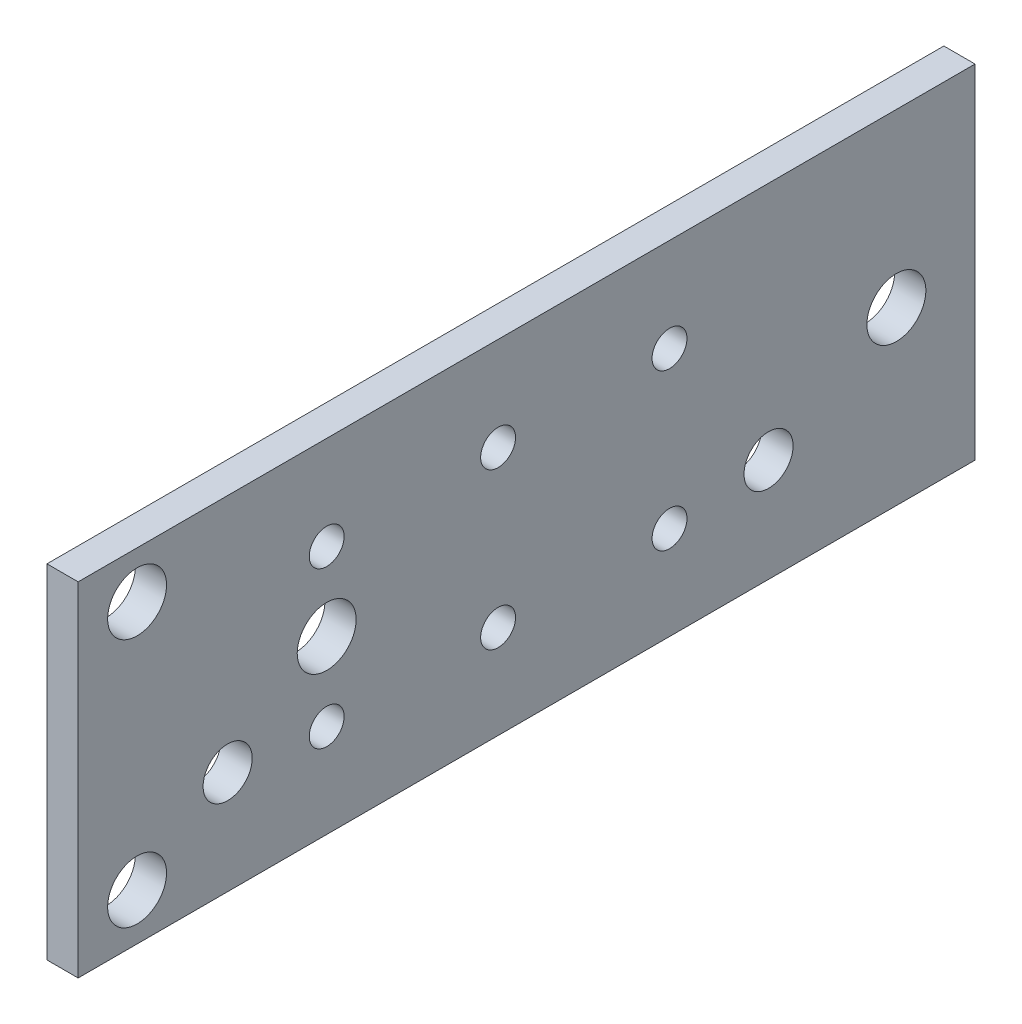
ISO-10303-21;
HEADER;
FILE_DESCRIPTION(('STEP AP214'),'2;1');
FILE_NAME('part.step','',(''),(''),'','','');
FILE_SCHEMA(('AUTOMOTIVE_DESIGN { 1 0 10303 214 1 1 1 1 }'));
ENDSEC;
DATA;
#1=APPLICATION_CONTEXT('core data for automotive mechanical design processes');
#2=APPLICATION_PROTOCOL_DEFINITION('international standard','automotive_design',2000,#1);
#3=PRODUCT_CONTEXT('',#1,'mechanical');
#4=PRODUCT('Part','Part','',(#3));
#5=PRODUCT_RELATED_PRODUCT_CATEGORY('part','',(#4));
#6=PRODUCT_DEFINITION_FORMATION('','',#4);
#7=PRODUCT_DEFINITION_CONTEXT('part definition',#1,'design');
#8=PRODUCT_DEFINITION('design','',#6,#7);
#9=PRODUCT_DEFINITION_SHAPE('','',#8);
#10=(LENGTH_UNIT() NAMED_UNIT(*) SI_UNIT(.MILLI.,.METRE.));
#11=(NAMED_UNIT(*) PLANE_ANGLE_UNIT() SI_UNIT($,.RADIAN.));
#12=(NAMED_UNIT(*) SI_UNIT($,.STERADIAN.) SOLID_ANGLE_UNIT());
#13=UNCERTAINTY_MEASURE_WITH_UNIT(LENGTH_MEASURE(1.E-05),#10,'distance_accuracy_value','');
#14=(GEOMETRIC_REPRESENTATION_CONTEXT(3) GLOBAL_UNCERTAINTY_ASSIGNED_CONTEXT((#13)) GLOBAL_UNIT_ASSIGNED_CONTEXT((#10,
#11,#12)) REPRESENTATION_CONTEXT('',''));
#15=CARTESIAN_POINT('',(0.,0.,0.));
#16=DIRECTION('',(0.,0.,1.));
#17=DIRECTION('',(1.,0.,0.));
#18=AXIS2_PLACEMENT_3D('',#15,#16,#17);
#19=CARTESIAN_POINT('',(0.,-34.925,0.));
#20=DIRECTION('',(0.,-1.,0.));
#21=DIRECTION('',(0.,0.,-1.));
#22=AXIS2_PLACEMENT_3D('',#19,#20,#21);
#23=PLANE('',#22);
#24=DIRECTION('',(0.,0.,-1.));
#25=VECTOR('',#24,1.);
#26=CARTESIAN_POINT('',(-3.175,-34.925,5.));
#27=LINE('',#26,#25);
#28=CARTESIAN_POINT('',(-3.175,-34.925,0.));
#29=VERTEX_POINT('',#28);
#30=CARTESIAN_POINT('',(-3.175,-34.925,-91.3));
#31=VERTEX_POINT('',#30);
#32=EDGE_CURVE('E162',#29,#31,#27,.T.);
#33=ORIENTED_EDGE('',*,*,#32,.T.);
#34=DIRECTION('',(1.,0.,0.));
#35=VECTOR('',#34,1.);
#36=CARTESIAN_POINT('',(-3.175,-34.925,-91.3));
#37=LINE('',#36,#35);
#38=CARTESIAN_POINT('',(0.,-34.925,-91.3));
#39=VERTEX_POINT('',#38);
#40=EDGE_CURVE('E247',#31,#39,#37,.T.);
#41=ORIENTED_EDGE('',*,*,#40,.T.);
#42=DIRECTION('',(0.,0.,1.));
#43=VECTOR('',#42,1.);
#44=CARTESIAN_POINT('',(0.,-34.925,5.));
#45=LINE('',#44,#43);
#46=CARTESIAN_POINT('',(0.,-34.925,0.));
#47=VERTEX_POINT('',#46);
#48=EDGE_CURVE('E110',#47,#39,#45,.F.);
#49=ORIENTED_EDGE('',*,*,#48,.F.);
#50=DIRECTION('',(1.,0.,0.));
#51=VECTOR('',#50,1.);
#52=CARTESIAN_POINT('',(-3.175,-34.925,0.));
#53=LINE('',#52,#51);
#54=EDGE_CURVE('E133',#29,#47,#53,.T.);
#55=ORIENTED_EDGE('',*,*,#54,.F.);
#56=EDGE_LOOP('',(#33,#41,#49,#55));
#57=FACE_BOUND('',#56,.T.);
#58=ADVANCED_FACE('F101',(#57),#23,.T.);
#59=CARTESIAN_POINT('',(-3.175,0.,-115.));
#60=DIRECTION('',(0.,-1.,0.));
#61=DIRECTION('',(0.,0.,-1.));
#62=AXIS2_PLACEMENT_3D('',#59,#60,#61);
#63=PLANE('',#62);
#64=DIRECTION('',(1.,0.,0.));
#65=VECTOR('',#64,1.);
#66=CARTESIAN_POINT('',(-3.175,0.,-91.3));
#67=LINE('',#66,#65);
#68=CARTESIAN_POINT('',(-3.175,0.,-91.3));
#69=VERTEX_POINT('',#68);
#70=CARTESIAN_POINT('',(0.,0.,-91.3));
#71=VERTEX_POINT('',#70);
#72=EDGE_CURVE('E125',#69,#71,#67,.T.);
#73=ORIENTED_EDGE('',*,*,#72,.F.);
#74=DIRECTION('',(0.,0.,1.));
#75=VECTOR('',#74,1.);
#76=CARTESIAN_POINT('',(-3.175,0.,-115.));
#77=LINE('',#76,#75);
#78=CARTESIAN_POINT('',(-3.175,0.,0.));
#79=VERTEX_POINT('',#78);
#80=EDGE_CURVE('E13',#69,#79,#77,.T.);
#81=ORIENTED_EDGE('',*,*,#80,.T.);
#82=DIRECTION('',(1.,0.,0.));
#83=VECTOR('',#82,1.);
#84=CARTESIAN_POINT('',(-3.175,0.,0.));
#85=LINE('',#84,#83);
#86=CARTESIAN_POINT('',(0.,0.,0.));
#87=VERTEX_POINT('',#86);
#88=EDGE_CURVE('E148',#79,#87,#85,.T.);
#89=ORIENTED_EDGE('',*,*,#88,.T.);
#90=DIRECTION('',(0.,0.,-1.));
#91=VECTOR('',#90,1.);
#92=CARTESIAN_POINT('',(0.,0.,-115.));
#93=LINE('',#92,#91);
#94=EDGE_CURVE('E113',#87,#71,#93,.T.);
#95=ORIENTED_EDGE('',*,*,#94,.T.);
#96=EDGE_LOOP('',(#73,#81,#89,#95));
#97=FACE_BOUND('',#96,.T.);
#98=ADVANCED_FACE('F102',(#97),#63,.F.);
#99=CARTESIAN_POINT('',(-3.175,3.17499999999999,5.));
#100=DIRECTION('',(-1.,0.,0.));
#101=DIRECTION('',(0.,0.,1.));
#102=AXIS2_PLACEMENT_3D('',#99,#100,#101);
#103=PLANE('',#102);
#104=DIRECTION('',(0.,1.,0.));
#105=VECTOR('',#104,1.);
#106=CARTESIAN_POINT('',(-3.175,0.,-91.3));
#107=LINE('',#106,#105);
#108=EDGE_CURVE('E145',#31,#69,#107,.T.);
#109=ORIENTED_EDGE('',*,*,#108,.F.);
#110=ORIENTED_EDGE('',*,*,#32,.F.);
#111=DIRECTION('',(0.,1.,0.));
#112=VECTOR('',#111,1.);
#113=CARTESIAN_POINT('',(-3.175,-34.925,0.));
#114=LINE('',#113,#112);
#115=EDGE_CURVE('E151',#29,#79,#114,.T.);
#116=ORIENTED_EDGE('',*,*,#115,.T.);
#117=ORIENTED_EDGE('',*,*,#80,.F.);
#118=EDGE_LOOP('',(#109,#110,#116,#117));
#119=FACE_BOUND('',#118,.T.);
#120=CARTESIAN_POINT('',(-3.175,-24.3999999999816,-70.2800000000124));
#121=DIRECTION('',(1.,0.,0.));
#122=DIRECTION('',(0.,0.,-1.));
#123=AXIS2_PLACEMENT_3D('',#120,#121,#122);
#124=CIRCLE('',#123,2.49999999999991);
#125=CARTESIAN_POINT('',(-3.175,-24.3999999999816,-72.7800000000124));
#126=VERTEX_POINT('',#125);
#127=EDGE_CURVE('E169',#126,#126,#124,.T.);
#128=ORIENTED_EDGE('',*,*,#127,.T.);
#129=EDGE_LOOP('',(#128));
#130=FACE_BOUND('',#129,.T.);
#131=CARTESIAN_POINT('',(-3.175,-25.3999999999814,-60.2000000000126));
#132=DIRECTION('',(1.,0.,0.));
#133=DIRECTION('',(0.,0.,-1.));
#134=AXIS2_PLACEMENT_3D('',#131,#132,#133);
#135=CIRCLE('',#134,1.77800000000008);
#136=CARTESIAN_POINT('',(-3.175,-25.3999999999814,-61.9780000000127));
#137=VERTEX_POINT('',#136);
#138=EDGE_CURVE('E177',#137,#137,#135,.T.);
#139=ORIENTED_EDGE('',*,*,#138,.T.);
#140=EDGE_LOOP('',(#139));
#141=FACE_BOUND('',#140,.T.);
#142=CARTESIAN_POINT('',(-3.175,-25.3999999999816,-42.7500000000124));
#143=DIRECTION('',(1.,0.,0.));
#144=DIRECTION('',(0.,0.,-1.));
#145=AXIS2_PLACEMENT_3D('',#142,#143,#144);
#146=CIRCLE('',#145,1.77799999999986);
#147=CARTESIAN_POINT('',(-3.175,-25.3999999999816,-44.5280000000123));
#148=VERTEX_POINT('',#147);
#149=EDGE_CURVE('E184',#148,#148,#146,.T.);
#150=ORIENTED_EDGE('',*,*,#149,.T.);
#151=EDGE_LOOP('',(#150));
#152=FACE_BOUND('',#151,.T.);
#153=CARTESIAN_POINT('',(-3.175,-25.3999999999817,-25.3000000000124));
#154=DIRECTION('',(1.,0.,0.));
#155=DIRECTION('',(0.,0.,-1.));
#156=AXIS2_PLACEMENT_3D('',#153,#154,#155);
#157=CIRCLE('',#156,1.77799999999986);
#158=CARTESIAN_POINT('',(-3.175,-25.3999999999817,-27.0780000000123));
#159=VERTEX_POINT('',#158);
#160=EDGE_CURVE('E191',#159,#159,#157,.T.);
#161=ORIENTED_EDGE('',*,*,#160,.T.);
#162=EDGE_LOOP('',(#161));
#163=FACE_BOUND('',#162,.T.);
#164=CARTESIAN_POINT('',(-3.175,-24.399999999982,-15.2200000000126));
#165=DIRECTION('',(1.,0.,0.));
#166=DIRECTION('',(0.,0.,-1.));
#167=AXIS2_PLACEMENT_3D('',#164,#165,#166);
#168=CIRCLE('',#167,2.49999999999991);
#169=CARTESIAN_POINT('',(-3.175,-24.399999999982,-17.7200000000125));
#170=VERTEX_POINT('',#169);
#171=EDGE_CURVE('E200',#170,#170,#168,.T.);
#172=ORIENTED_EDGE('',*,*,#171,.T.);
#173=EDGE_LOOP('',(#172));
#174=FACE_BOUND('',#173,.T.);
#175=CARTESIAN_POINT('',(-3.175,-9.52499999998159,-25.3000000000123));
#176=DIRECTION('',(1.,0.,0.));
#177=DIRECTION('',(0.,0.,-1.));
#178=AXIS2_PLACEMENT_3D('',#175,#176,#177);
#179=CIRCLE('',#178,1.77799999999986);
#180=CARTESIAN_POINT('',(-3.175,-9.52499999998159,-27.0780000000122));
#181=VERTEX_POINT('',#180);
#182=EDGE_CURVE('E205',#181,#181,#179,.T.);
#183=ORIENTED_EDGE('',*,*,#182,.T.);
#184=EDGE_LOOP('',(#183));
#185=FACE_BOUND('',#184,.T.);
#186=CARTESIAN_POINT('',(-3.175,-9.52499999998147,-42.7500000000123));
#187=DIRECTION('',(1.,0.,0.));
#188=DIRECTION('',(0.,0.,-1.));
#189=AXIS2_PLACEMENT_3D('',#186,#187,#188);
#190=CIRCLE('',#189,1.77799999999986);
#191=CARTESIAN_POINT('',(-3.175,-9.52499999998147,-44.5280000000121));
#192=VERTEX_POINT('',#191);
#193=EDGE_CURVE('E209',#192,#192,#190,.T.);
#194=ORIENTED_EDGE('',*,*,#193,.T.);
#195=EDGE_LOOP('',(#194));
#196=FACE_BOUND('',#195,.T.);
#197=CARTESIAN_POINT('',(-3.175,-9.52499999998135,-60.2000000000125));
#198=DIRECTION('',(1.,0.,0.));
#199=DIRECTION('',(0.,0.,-1.));
#200=AXIS2_PLACEMENT_3D('',#197,#198,#199);
#201=CIRCLE('',#200,1.77800000000008);
#202=CARTESIAN_POINT('',(-3.175,-9.52499999998135,-61.9780000000125));
#203=VERTEX_POINT('',#202);
#204=EDGE_CURVE('E156',#203,#203,#201,.T.);
#205=ORIENTED_EDGE('',*,*,#204,.T.);
#206=EDGE_LOOP('',(#205));
#207=FACE_BOUND('',#206,.T.);
#208=CARTESIAN_POINT('',(-3.175,-17.4625,-83.29));
#209=DIRECTION('',(-1.,0.,0.));
#210=DIRECTION('',(0.,0.,1.));
#211=AXIS2_PLACEMENT_3D('',#208,#209,#210);
#212=CIRCLE('',#211,3.00000000000002);
#213=CARTESIAN_POINT('',(-3.175,-17.4625,-80.29));
#214=VERTEX_POINT('',#213);
#215=EDGE_CURVE('E229',#214,#214,#212,.T.);
#216=ORIENTED_EDGE('',*,*,#215,.F.);
#217=EDGE_LOOP('',(#216));
#218=FACE_BOUND('',#217,.T.);
#219=CARTESIAN_POINT('',(-3.175,-4.7625,-6.));
#220=DIRECTION('',(-1.,0.,0.));
#221=DIRECTION('',(0.,0.,1.));
#222=AXIS2_PLACEMENT_3D('',#219,#220,#221);
#223=CIRCLE('',#222,3.);
#224=CARTESIAN_POINT('',(-3.175,-4.7625,-3.));
#225=VERTEX_POINT('',#224);
#226=EDGE_CURVE('E222',#225,#225,#223,.T.);
#227=ORIENTED_EDGE('',*,*,#226,.F.);
#228=EDGE_LOOP('',(#227));
#229=FACE_BOUND('',#228,.T.);
#230=CARTESIAN_POINT('',(-3.175,-30.1625,-6.));
#231=DIRECTION('',(-1.,0.,0.));
#232=DIRECTION('',(0.,0.,1.));
#233=AXIS2_PLACEMENT_3D('',#230,#231,#232);
#234=CIRCLE('',#233,3.);
#235=CARTESIAN_POINT('',(-3.175,-30.1625,-3.));
#236=VERTEX_POINT('',#235);
#237=EDGE_CURVE('E220',#236,#236,#234,.T.);
#238=ORIENTED_EDGE('',*,*,#237,.F.);
#239=EDGE_LOOP('',(#238));
#240=FACE_BOUND('',#239,.T.);
#241=CARTESIAN_POINT('',(-3.175,-17.4625,-25.3));
#242=DIRECTION('',(-1.,0.,0.));
#243=DIRECTION('',(0.,0.,1.));
#244=AXIS2_PLACEMENT_3D('',#241,#242,#243);
#245=CIRCLE('',#244,3.00000000000001);
#246=CARTESIAN_POINT('',(-3.175,-17.4625,-22.3));
#247=VERTEX_POINT('',#246);
#248=EDGE_CURVE('E218',#247,#247,#245,.T.);
#249=ORIENTED_EDGE('',*,*,#248,.F.);
#250=EDGE_LOOP('',(#249));
#251=FACE_BOUND('',#250,.T.);
#252=ADVANCED_FACE('F157',(#119,#130,#141,#152,#163,#174,#185,#196,#207,#218,#229,#240,#251),
#103,.T.);
#253=CARTESIAN_POINT('',(0.,-34.925,5.));
#254=DIRECTION('',(-1.,0.,0.));
#255=DIRECTION('',(0.,0.,1.));
#256=AXIS2_PLACEMENT_3D('',#253,#254,#255);
#257=PLANE('',#256);
#258=CARTESIAN_POINT('',(0.,-17.4625,-25.3));
#259=DIRECTION('',(-1.,0.,0.));
#260=DIRECTION('',(0.,0.,1.));
#261=AXIS2_PLACEMENT_3D('',#258,#259,#260);
#262=CIRCLE('',#261,3.00000000000001);
#263=CARTESIAN_POINT('',(0.,-17.4625,-22.3));
#264=VERTEX_POINT('',#263);
#265=EDGE_CURVE('E232',#264,#264,#262,.T.);
#266=ORIENTED_EDGE('',*,*,#265,.T.);
#267=EDGE_LOOP('',(#266));
#268=FACE_BOUND('',#267,.T.);
#269=CARTESIAN_POINT('',(0.,-30.1625,-6.));
#270=DIRECTION('',(-1.,0.,0.));
#271=DIRECTION('',(0.,0.,1.));
#272=AXIS2_PLACEMENT_3D('',#269,#270,#271);
#273=CIRCLE('',#272,3.);
#274=CARTESIAN_POINT('',(0.,-30.1625,-3.));
#275=VERTEX_POINT('',#274);
#276=EDGE_CURVE('E221',#275,#275,#273,.T.);
#277=ORIENTED_EDGE('',*,*,#276,.T.);
#278=EDGE_LOOP('',(#277));
#279=FACE_BOUND('',#278,.T.);
#280=CARTESIAN_POINT('',(0.,-4.7625,-6.));
#281=DIRECTION('',(-1.,0.,0.));
#282=DIRECTION('',(0.,0.,1.));
#283=AXIS2_PLACEMENT_3D('',#280,#281,#282);
#284=CIRCLE('',#283,3.);
#285=CARTESIAN_POINT('',(0.,-4.7625,-3.));
#286=VERTEX_POINT('',#285);
#287=EDGE_CURVE('E227',#286,#286,#284,.T.);
#288=ORIENTED_EDGE('',*,*,#287,.T.);
#289=EDGE_LOOP('',(#288));
#290=FACE_BOUND('',#289,.T.);
#291=CARTESIAN_POINT('',(0.,-17.4625,-83.29));
#292=DIRECTION('',(-1.,0.,0.));
#293=DIRECTION('',(0.,0.,1.));
#294=AXIS2_PLACEMENT_3D('',#291,#292,#293);
#295=CIRCLE('',#294,3.00000000000002);
#296=CARTESIAN_POINT('',(0.,-17.4625,-80.29));
#297=VERTEX_POINT('',#296);
#298=EDGE_CURVE('E175',#297,#297,#295,.T.);
#299=ORIENTED_EDGE('',*,*,#298,.T.);
#300=EDGE_LOOP('',(#299));
#301=FACE_BOUND('',#300,.T.);
#302=CARTESIAN_POINT('',(0.,-9.52499999998135,-60.2000000000125));
#303=DIRECTION('',(1.,0.,0.));
#304=DIRECTION('',(0.,0.,-1.));
#305=AXIS2_PLACEMENT_3D('',#302,#303,#304);
#306=CIRCLE('',#305,1.77800000000008);
#307=CARTESIAN_POINT('',(0.,-9.52499999998135,-61.9780000000125));
#308=VERTEX_POINT('',#307);
#309=EDGE_CURVE('E212',#308,#308,#306,.T.);
#310=ORIENTED_EDGE('',*,*,#309,.F.);
#311=EDGE_LOOP('',(#310));
#312=FACE_BOUND('',#311,.T.);
#313=CARTESIAN_POINT('',(0.,-9.52499999998147,-42.7500000000123));
#314=DIRECTION('',(1.,0.,0.));
#315=DIRECTION('',(0.,0.,-1.));
#316=AXIS2_PLACEMENT_3D('',#313,#314,#315);
#317=CIRCLE('',#316,1.77799999999986);
#318=CARTESIAN_POINT('',(0.,-9.52499999998147,-44.5280000000121));
#319=VERTEX_POINT('',#318);
#320=EDGE_CURVE('E207',#319,#319,#317,.T.);
#321=ORIENTED_EDGE('',*,*,#320,.F.);
#322=EDGE_LOOP('',(#321));
#323=FACE_BOUND('',#322,.T.);
#324=CARTESIAN_POINT('',(0.,-9.52499999998159,-25.3000000000123));
#325=DIRECTION('',(1.,0.,0.));
#326=DIRECTION('',(0.,0.,-1.));
#327=AXIS2_PLACEMENT_3D('',#324,#325,#326);
#328=CIRCLE('',#327,1.77799999999986);
#329=CARTESIAN_POINT('',(0.,-9.52499999998159,-27.0780000000122));
#330=VERTEX_POINT('',#329);
#331=EDGE_CURVE('E198',#330,#330,#328,.T.);
#332=ORIENTED_EDGE('',*,*,#331,.F.);
#333=EDGE_LOOP('',(#332));
#334=FACE_BOUND('',#333,.T.);
#335=CARTESIAN_POINT('',(0.,-24.399999999982,-15.2200000000126));
#336=DIRECTION('',(1.,0.,0.));
#337=DIRECTION('',(0.,0.,-1.));
#338=AXIS2_PLACEMENT_3D('',#335,#336,#337);
#339=CIRCLE('',#338,2.49999999999991);
#340=CARTESIAN_POINT('',(0.,-24.399999999982,-17.7200000000125));
#341=VERTEX_POINT('',#340);
#342=EDGE_CURVE('E193',#341,#341,#339,.T.);
#343=ORIENTED_EDGE('',*,*,#342,.F.);
#344=EDGE_LOOP('',(#343));
#345=FACE_BOUND('',#344,.T.);
#346=CARTESIAN_POINT('',(0.,-25.3999999999817,-25.3000000000124));
#347=DIRECTION('',(1.,0.,0.));
#348=DIRECTION('',(0.,0.,-1.));
#349=AXIS2_PLACEMENT_3D('',#346,#347,#348);
#350=CIRCLE('',#349,1.77799999999986);
#351=CARTESIAN_POINT('',(0.,-25.3999999999817,-27.0780000000123));
#352=VERTEX_POINT('',#351);
#353=EDGE_CURVE('E189',#352,#352,#350,.T.);
#354=ORIENTED_EDGE('',*,*,#353,.F.);
#355=EDGE_LOOP('',(#354));
#356=FACE_BOUND('',#355,.T.);
#357=CARTESIAN_POINT('',(0.,-25.3999999999816,-42.7500000000124));
#358=DIRECTION('',(1.,0.,0.));
#359=DIRECTION('',(0.,0.,-1.));
#360=AXIS2_PLACEMENT_3D('',#357,#358,#359);
#361=CIRCLE('',#360,1.77799999999986);
#362=CARTESIAN_POINT('',(0.,-25.3999999999816,-44.5280000000123));
#363=VERTEX_POINT('',#362);
#364=EDGE_CURVE('E185',#363,#363,#361,.T.);
#365=ORIENTED_EDGE('',*,*,#364,.F.);
#366=EDGE_LOOP('',(#365));
#367=FACE_BOUND('',#366,.T.);
#368=CARTESIAN_POINT('',(0.,-25.3999999999814,-60.2000000000126));
#369=DIRECTION('',(1.,0.,0.));
#370=DIRECTION('',(0.,0.,-1.));
#371=AXIS2_PLACEMENT_3D('',#368,#369,#370);
#372=CIRCLE('',#371,1.77800000000008);
#373=CARTESIAN_POINT('',(0.,-25.3999999999814,-61.9780000000127));
#374=VERTEX_POINT('',#373);
#375=EDGE_CURVE('E176',#374,#374,#372,.T.);
#376=ORIENTED_EDGE('',*,*,#375,.F.);
#377=EDGE_LOOP('',(#376));
#378=FACE_BOUND('',#377,.T.);
#379=CARTESIAN_POINT('',(0.,-24.3999999999816,-70.2800000000124));
#380=DIRECTION('',(1.,0.,0.));
#381=DIRECTION('',(0.,0.,-1.));
#382=AXIS2_PLACEMENT_3D('',#379,#380,#381);
#383=CIRCLE('',#382,2.49999999999991);
#384=CARTESIAN_POINT('',(0.,-24.3999999999816,-72.7800000000124));
#385=VERTEX_POINT('',#384);
#386=EDGE_CURVE('E173',#385,#385,#383,.T.);
#387=ORIENTED_EDGE('',*,*,#386,.F.);
#388=EDGE_LOOP('',(#387));
#389=FACE_BOUND('',#388,.T.);
#390=ORIENTED_EDGE('',*,*,#48,.T.);
#391=DIRECTION('',(0.,1.,0.));
#392=VECTOR('',#391,1.);
#393=CARTESIAN_POINT('',(0.,-34.925,-91.3));
#394=LINE('',#393,#392);
#395=EDGE_CURVE('E241',#39,#71,#394,.T.);
#396=ORIENTED_EDGE('',*,*,#395,.T.);
#397=ORIENTED_EDGE('',*,*,#94,.F.);
#398=DIRECTION('',(0.,1.,0.));
#399=VECTOR('',#398,1.);
#400=CARTESIAN_POINT('',(0.,-34.925,0.));
#401=LINE('',#400,#399);
#402=EDGE_CURVE('E153',#47,#87,#401,.T.);
#403=ORIENTED_EDGE('',*,*,#402,.F.);
#404=EDGE_LOOP('',(#390,#396,#397,#403));
#405=FACE_BOUND('',#404,.T.);
#406=ADVANCED_FACE('F244',(#268,#279,#290,#301,#312,#323,#334,#345,#356,#367,#378,#389,#405),
#257,.F.);
#407=CARTESIAN_POINT('',(0.,-17.4625,-25.3));
#408=DIRECTION('',(-1.,0.,0.));
#409=DIRECTION('',(0.,0.,1.));
#410=AXIS2_PLACEMENT_3D('',#407,#408,#409);
#411=CYLINDRICAL_SURFACE('',#410,3.00000000000001);
#412=ORIENTED_EDGE('',*,*,#265,.F.);
#413=EDGE_LOOP('',(#412));
#414=FACE_BOUND('',#413,.T.);
#415=ORIENTED_EDGE('',*,*,#248,.T.);
#416=EDGE_LOOP('',(#415));
#417=FACE_BOUND('',#416,.T.);
#418=ADVANCED_FACE('F266',(#414,#417),#411,.F.);
#419=CARTESIAN_POINT('',(0.,-30.1625,-6.));
#420=DIRECTION('',(-1.,0.,0.));
#421=DIRECTION('',(0.,0.,1.));
#422=AXIS2_PLACEMENT_3D('',#419,#420,#421);
#423=CYLINDRICAL_SURFACE('',#422,3.);
#424=ORIENTED_EDGE('',*,*,#276,.F.);
#425=EDGE_LOOP('',(#424));
#426=FACE_BOUND('',#425,.T.);
#427=ORIENTED_EDGE('',*,*,#237,.T.);
#428=EDGE_LOOP('',(#427));
#429=FACE_BOUND('',#428,.T.);
#430=ADVANCED_FACE('F271',(#426,#429),#423,.F.);
#431=CARTESIAN_POINT('',(0.,-4.7625,-6.));
#432=DIRECTION('',(-1.,0.,0.));
#433=DIRECTION('',(0.,0.,1.));
#434=AXIS2_PLACEMENT_3D('',#431,#432,#433);
#435=CYLINDRICAL_SURFACE('',#434,3.);
#436=ORIENTED_EDGE('',*,*,#287,.F.);
#437=EDGE_LOOP('',(#436));
#438=FACE_BOUND('',#437,.T.);
#439=ORIENTED_EDGE('',*,*,#226,.T.);
#440=EDGE_LOOP('',(#439));
#441=FACE_BOUND('',#440,.T.);
#442=ADVANCED_FACE('F337',(#438,#441),#435,.F.);
#443=CARTESIAN_POINT('',(0.,-17.4625,-83.29));
#444=DIRECTION('',(-1.,0.,0.));
#445=DIRECTION('',(0.,0.,1.));
#446=AXIS2_PLACEMENT_3D('',#443,#444,#445);
#447=CYLINDRICAL_SURFACE('',#446,3.00000000000002);
#448=ORIENTED_EDGE('',*,*,#215,.T.);
#449=EDGE_LOOP('',(#448));
#450=FACE_BOUND('',#449,.T.);
#451=ORIENTED_EDGE('',*,*,#298,.F.);
#452=EDGE_LOOP('',(#451));
#453=FACE_BOUND('',#452,.T.);
#454=ADVANCED_FACE('F331',(#450,#453),#447,.F.);
#455=CARTESIAN_POINT('',(-3.175,-9.52499999998135,-60.2000000000125));
#456=DIRECTION('',(1.,0.,0.));
#457=DIRECTION('',(0.,0.,-1.));
#458=AXIS2_PLACEMENT_3D('',#455,#456,#457);
#459=CYLINDRICAL_SURFACE('',#458,1.77800000000008);
#460=ORIENTED_EDGE('',*,*,#204,.F.);
#461=EDGE_LOOP('',(#460));
#462=FACE_BOUND('',#461,.T.);
#463=ORIENTED_EDGE('',*,*,#309,.T.);
#464=EDGE_LOOP('',(#463));
#465=FACE_BOUND('',#464,.T.);
#466=ADVANCED_FACE('F329',(#462,#465),#459,.F.);
#467=CARTESIAN_POINT('',(-3.175,-9.52499999998147,-42.7500000000123));
#468=DIRECTION('',(1.,0.,0.));
#469=DIRECTION('',(0.,0.,-1.));
#470=AXIS2_PLACEMENT_3D('',#467,#468,#469);
#471=CYLINDRICAL_SURFACE('',#470,1.77799999999986);
#472=ORIENTED_EDGE('',*,*,#193,.F.);
#473=EDGE_LOOP('',(#472));
#474=FACE_BOUND('',#473,.T.);
#475=ORIENTED_EDGE('',*,*,#320,.T.);
#476=EDGE_LOOP('',(#475));
#477=FACE_BOUND('',#476,.T.);
#478=ADVANCED_FACE('F323',(#474,#477),#471,.F.);
#479=CARTESIAN_POINT('',(-3.175,-9.52499999998159,-25.3000000000123));
#480=DIRECTION('',(1.,0.,0.));
#481=DIRECTION('',(0.,0.,-1.));
#482=AXIS2_PLACEMENT_3D('',#479,#480,#481);
#483=CYLINDRICAL_SURFACE('',#482,1.77799999999986);
#484=ORIENTED_EDGE('',*,*,#182,.F.);
#485=EDGE_LOOP('',(#484));
#486=FACE_BOUND('',#485,.T.);
#487=ORIENTED_EDGE('',*,*,#331,.T.);
#488=EDGE_LOOP('',(#487));
#489=FACE_BOUND('',#488,.T.);
#490=ADVANCED_FACE('F318',(#486,#489),#483,.F.);
#491=CARTESIAN_POINT('',(-3.175,-24.399999999982,-15.2200000000126));
#492=DIRECTION('',(1.,0.,0.));
#493=DIRECTION('',(0.,0.,-1.));
#494=AXIS2_PLACEMENT_3D('',#491,#492,#493);
#495=CYLINDRICAL_SURFACE('',#494,2.49999999999991);
#496=ORIENTED_EDGE('',*,*,#171,.F.);
#497=EDGE_LOOP('',(#496));
#498=FACE_BOUND('',#497,.T.);
#499=ORIENTED_EDGE('',*,*,#342,.T.);
#500=EDGE_LOOP('',(#499));
#501=FACE_BOUND('',#500,.T.);
#502=ADVANCED_FACE('F317',(#498,#501),#495,.F.);
#503=CARTESIAN_POINT('',(-3.175,-25.3999999999817,-25.3000000000124));
#504=DIRECTION('',(1.,0.,0.));
#505=DIRECTION('',(0.,0.,-1.));
#506=AXIS2_PLACEMENT_3D('',#503,#504,#505);
#507=CYLINDRICAL_SURFACE('',#506,1.77799999999986);
#508=ORIENTED_EDGE('',*,*,#160,.F.);
#509=EDGE_LOOP('',(#508));
#510=FACE_BOUND('',#509,.T.);
#511=ORIENTED_EDGE('',*,*,#353,.T.);
#512=EDGE_LOOP('',(#511));
#513=FACE_BOUND('',#512,.T.);
#514=ADVANCED_FACE('F315',(#510,#513),#507,.F.);
#515=CARTESIAN_POINT('',(-3.175,-25.3999999999816,-42.7500000000124));
#516=DIRECTION('',(1.,0.,0.));
#517=DIRECTION('',(0.,0.,-1.));
#518=AXIS2_PLACEMENT_3D('',#515,#516,#517);
#519=CYLINDRICAL_SURFACE('',#518,1.77799999999986);
#520=ORIENTED_EDGE('',*,*,#149,.F.);
#521=EDGE_LOOP('',(#520));
#522=FACE_BOUND('',#521,.T.);
#523=ORIENTED_EDGE('',*,*,#364,.T.);
#524=EDGE_LOOP('',(#523));
#525=FACE_BOUND('',#524,.T.);
#526=ADVANCED_FACE('F304',(#522,#525),#519,.F.);
#527=CARTESIAN_POINT('',(-3.175,-25.3999999999814,-60.2000000000126));
#528=DIRECTION('',(1.,0.,0.));
#529=DIRECTION('',(0.,0.,-1.));
#530=AXIS2_PLACEMENT_3D('',#527,#528,#529);
#531=CYLINDRICAL_SURFACE('',#530,1.77800000000008);
#532=ORIENTED_EDGE('',*,*,#138,.F.);
#533=EDGE_LOOP('',(#532));
#534=FACE_BOUND('',#533,.T.);
#535=ORIENTED_EDGE('',*,*,#375,.T.);
#536=EDGE_LOOP('',(#535));
#537=FACE_BOUND('',#536,.T.);
#538=ADVANCED_FACE('F299',(#534,#537),#531,.F.);
#539=CARTESIAN_POINT('',(-3.175,-24.3999999999816,-70.2800000000124));
#540=DIRECTION('',(1.,0.,0.));
#541=DIRECTION('',(0.,0.,-1.));
#542=AXIS2_PLACEMENT_3D('',#539,#540,#541);
#543=CYLINDRICAL_SURFACE('',#542,2.49999999999991);
#544=ORIENTED_EDGE('',*,*,#127,.F.);
#545=EDGE_LOOP('',(#544));
#546=FACE_BOUND('',#545,.T.);
#547=ORIENTED_EDGE('',*,*,#386,.T.);
#548=EDGE_LOOP('',(#547));
#549=FACE_BOUND('',#548,.T.);
#550=ADVANCED_FACE('F256',(#546,#549),#543,.F.);
#551=CARTESIAN_POINT('',(-3.175,-34.925,0.));
#552=DIRECTION('',(0.,0.,-1.));
#553=DIRECTION('',(-1.,0.,0.));
#554=AXIS2_PLACEMENT_3D('',#551,#552,#553);
#555=PLANE('',#554);
#556=ORIENTED_EDGE('',*,*,#402,.T.);
#557=ORIENTED_EDGE('',*,*,#88,.F.);
#558=ORIENTED_EDGE('',*,*,#115,.F.);
#559=ORIENTED_EDGE('',*,*,#54,.T.);
#560=EDGE_LOOP('',(#556,#557,#558,#559));
#561=FACE_BOUND('',#560,.T.);
#562=ADVANCED_FACE('F154',(#561),#555,.F.);
#563=CARTESIAN_POINT('',(-3.175,0.,-91.3));
#564=DIRECTION('',(0.,0.,-1.));
#565=DIRECTION('',(-1.,0.,0.));
#566=AXIS2_PLACEMENT_3D('',#563,#564,#565);
#567=PLANE('',#566);
#568=ORIENTED_EDGE('',*,*,#40,.F.);
#569=ORIENTED_EDGE('',*,*,#108,.T.);
#570=ORIENTED_EDGE('',*,*,#72,.T.);
#571=ORIENTED_EDGE('',*,*,#395,.F.);
#572=EDGE_LOOP('',(#568,#569,#570,#571));
#573=FACE_BOUND('',#572,.T.);
#574=ADVANCED_FACE('F249',(#573),#567,.T.);
#575=CLOSED_SHELL('',(#58,#98,#252,#406,#418,#430,#442,#454,#466,#478,#490,#502,#514,#526,#538,
#550,#562,#574));
#576=MANIFOLD_SOLID_BREP('B2',#575);
#577=ADVANCED_BREP_SHAPE_REPRESENTATION('',(#18,#576),#14);
#578=SHAPE_DEFINITION_REPRESENTATION(#9,#577);
ENDSEC;
END-ISO-10303-21;
